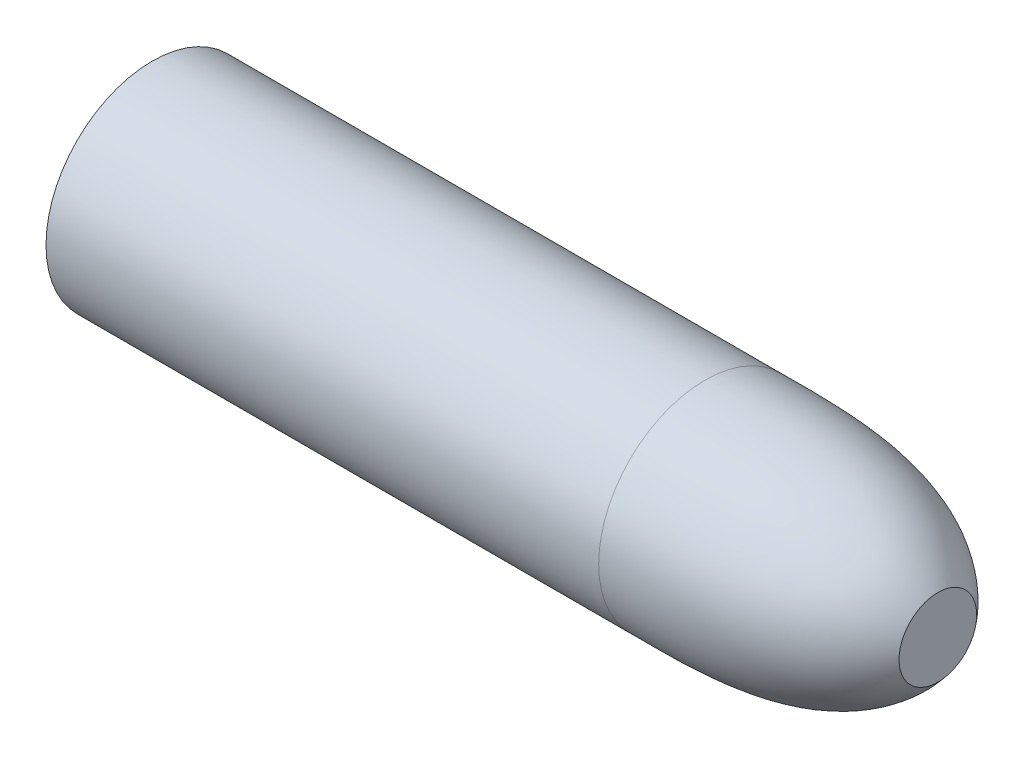
ISO-10303-21;
HEADER;
FILE_DESCRIPTION(('STEP AP214'),'2;1');
FILE_NAME('part.step','',(''),(''),'','','');
FILE_SCHEMA(('AUTOMOTIVE_DESIGN { 1 0 10303 214 1 1 1 1 }'));
ENDSEC;
DATA;
#1=APPLICATION_CONTEXT('core data for automotive mechanical design processes');
#2=APPLICATION_PROTOCOL_DEFINITION('international standard','automotive_design',2000,#1);
#3=PRODUCT_CONTEXT('',#1,'mechanical');
#4=PRODUCT('Part','Part','',(#3));
#5=PRODUCT_RELATED_PRODUCT_CATEGORY('part','',(#4));
#6=PRODUCT_DEFINITION_FORMATION('','',#4);
#7=PRODUCT_DEFINITION_CONTEXT('part definition',#1,'design');
#8=PRODUCT_DEFINITION('design','',#6,#7);
#9=PRODUCT_DEFINITION_SHAPE('','',#8);
#10=(LENGTH_UNIT() NAMED_UNIT(*) SI_UNIT(.MILLI.,.METRE.));
#11=(NAMED_UNIT(*) PLANE_ANGLE_UNIT() SI_UNIT($,.RADIAN.));
#12=(NAMED_UNIT(*) SI_UNIT($,.STERADIAN.) SOLID_ANGLE_UNIT());
#13=UNCERTAINTY_MEASURE_WITH_UNIT(LENGTH_MEASURE(1.E-05),#10,'distance_accuracy_value','');
#14=(GEOMETRIC_REPRESENTATION_CONTEXT(3) GLOBAL_UNCERTAINTY_ASSIGNED_CONTEXT((#13)) GLOBAL_UNIT_ASSIGNED_CONTEXT((#10,
#11,#12)) REPRESENTATION_CONTEXT('',''));
#15=CARTESIAN_POINT('',(0.,0.,0.));
#16=DIRECTION('',(0.,0.,1.));
#17=DIRECTION('',(1.,0.,0.));
#18=AXIS2_PLACEMENT_3D('',#15,#16,#17);
#19=CARTESIAN_POINT('',(257.,12.7,0.));
#20=CARTESIAN_POINT('',(239.015346920491,35.3922843161688,0.));
#21=CARTESIAN_POINT('',(206.626858967021,34.8832790495562,0.));
#22=CARTESIAN_POINT('',(180.8,34.75,0.));
#23=B_SPLINE_CURVE_WITH_KNOTS('',3,(#19,#20,#21,#22),.UNSPECIFIED.,.F.,.F.,(4,4),(0.,1.),.UNSPECIFIED.);
#24=CARTESIAN_POINT('',(0.,0.,0.));
#25=DIRECTION('',(-1.,0.,0.));
#26=AXIS1_PLACEMENT('',#24,#25);
#27=SURFACE_OF_REVOLUTION('',#23,#26);
#28=CARTESIAN_POINT('',(180.8,0.,0.));
#29=DIRECTION('',(-1.,0.,0.));
#30=DIRECTION('',(0.,0.,1.));
#31=AXIS2_PLACEMENT_3D('',#28,#29,#30);
#32=CIRCLE('',#31,34.75);
#33=CARTESIAN_POINT('',(180.8,0.,34.75));
#34=VERTEX_POINT('',#33);
#35=EDGE_CURVE('E45',#34,#34,#32,.T.);
#36=ORIENTED_EDGE('',*,*,#35,.F.);
#37=EDGE_LOOP('',(#36));
#38=FACE_BOUND('',#37,.T.);
#39=CARTESIAN_POINT('',(257.,0.,0.));
#40=DIRECTION('',(-1.,0.,0.));
#41=DIRECTION('',(0.,0.,1.));
#42=AXIS2_PLACEMENT_3D('',#39,#40,#41);
#43=CIRCLE('',#42,12.7);
#44=CARTESIAN_POINT('',(257.,0.,12.7));
#45=VERTEX_POINT('',#44);
#46=EDGE_CURVE('E10',#45,#45,#43,.T.);
#47=ORIENTED_EDGE('',*,*,#46,.T.);
#48=EDGE_LOOP('',(#47));
#49=FACE_BOUND('',#48,.T.);
#50=ADVANCED_FACE('F34',(#38,#49),#27,.T.);
#51=CARTESIAN_POINT('',(257.,0.,0.));
#52=DIRECTION('',(-1.,0.,0.));
#53=DIRECTION('',(0.,0.,1.));
#54=AXIS2_PLACEMENT_3D('',#51,#52,#53);
#55=PLANE('',#54);
#56=ORIENTED_EDGE('',*,*,#46,.F.);
#57=EDGE_LOOP('',(#56));
#58=FACE_BOUND('',#57,.T.);
#59=ADVANCED_FACE('F61',(#58),#55,.F.);
#60=CARTESIAN_POINT('',(0.,0.,0.));
#61=DIRECTION('',(1.,0.,0.));
#62=DIRECTION('',(0.,0.,-1.));
#63=AXIS2_PLACEMENT_3D('',#60,#61,#62);
#64=PLANE('',#63);
#65=CARTESIAN_POINT('',(0.,0.,0.));
#66=DIRECTION('',(-1.,0.,0.));
#67=DIRECTION('',(0.,0.,1.));
#68=AXIS2_PLACEMENT_3D('',#65,#66,#67);
#69=CIRCLE('',#68,34.75);
#70=CARTESIAN_POINT('',(0.,0.,34.75));
#71=VERTEX_POINT('',#70);
#72=EDGE_CURVE('E41',#71,#71,#69,.T.);
#73=ORIENTED_EDGE('',*,*,#72,.T.);
#74=EDGE_LOOP('',(#73));
#75=FACE_BOUND('',#74,.T.);
#76=ADVANCED_FACE('F65',(#75),#64,.F.);
#77=CARTESIAN_POINT('',(0.,0.,0.));
#78=DIRECTION('',(-1.,0.,0.));
#79=DIRECTION('',(0.,0.,1.));
#80=AXIS2_PLACEMENT_3D('',#77,#78,#79);
#81=CYLINDRICAL_SURFACE('',#80,34.75);
#82=ORIENTED_EDGE('',*,*,#72,.F.);
#83=EDGE_LOOP('',(#82));
#84=FACE_BOUND('',#83,.T.);
#85=ORIENTED_EDGE('',*,*,#35,.T.);
#86=EDGE_LOOP('',(#85));
#87=FACE_BOUND('',#86,.T.);
#88=ADVANCED_FACE('F58',(#84,#87),#81,.T.);
#89=CLOSED_SHELL('',(#50,#59,#76,#88));
#90=MANIFOLD_SOLID_BREP('B2',#89);
#91=ADVANCED_BREP_SHAPE_REPRESENTATION('',(#18,#90),#14);
#92=SHAPE_DEFINITION_REPRESENTATION(#9,#91);
ENDSEC;
END-ISO-10303-21;
